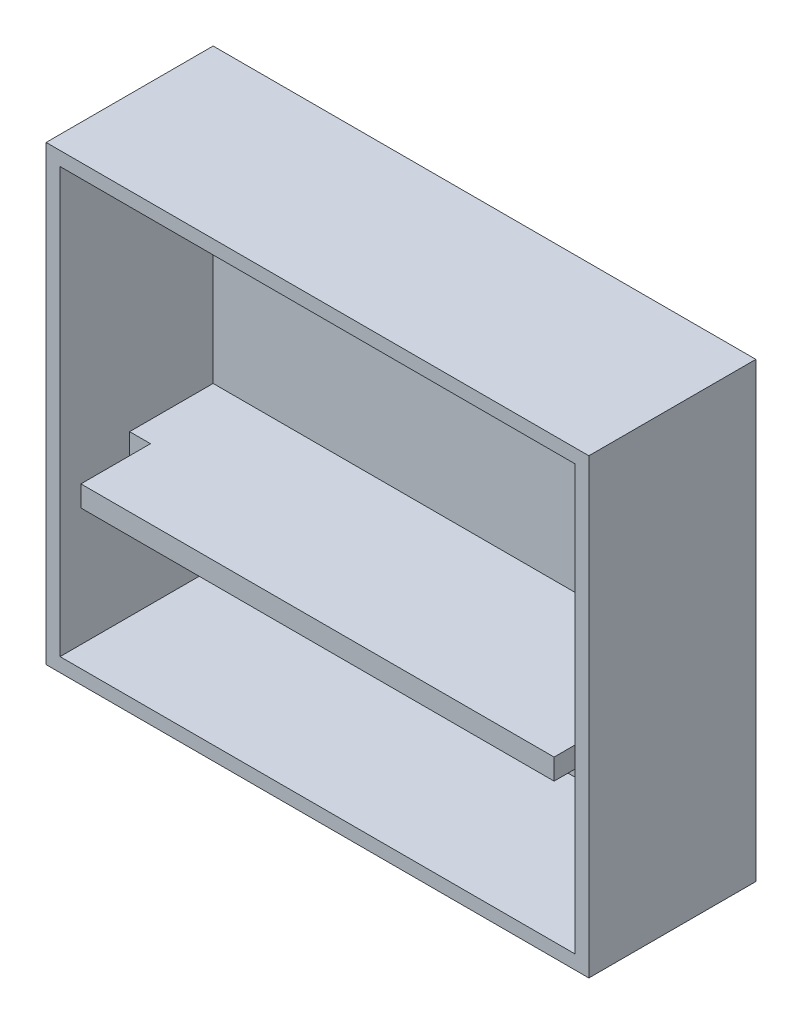
ISO-10303-21;
HEADER;
FILE_DESCRIPTION(('STEP AP214'),'2;1');
FILE_NAME('part.step','',(''),(''),'','','');
FILE_SCHEMA(('AUTOMOTIVE_DESIGN { 1 0 10303 214 1 1 1 1 }'));
ENDSEC;
DATA;
#1=APPLICATION_CONTEXT('core data for automotive mechanical design processes');
#2=APPLICATION_PROTOCOL_DEFINITION('international standard','automotive_design',2000,#1);
#3=PRODUCT_CONTEXT('',#1,'mechanical');
#4=PRODUCT('Part','Part','',(#3));
#5=PRODUCT_RELATED_PRODUCT_CATEGORY('part','',(#4));
#6=PRODUCT_DEFINITION_FORMATION('','',#4);
#7=PRODUCT_DEFINITION_CONTEXT('part definition',#1,'design');
#8=PRODUCT_DEFINITION('design','',#6,#7);
#9=PRODUCT_DEFINITION_SHAPE('','',#8);
#10=(LENGTH_UNIT() NAMED_UNIT(*) SI_UNIT(.MILLI.,.METRE.));
#11=(NAMED_UNIT(*) PLANE_ANGLE_UNIT() SI_UNIT($,.RADIAN.));
#12=(NAMED_UNIT(*) SI_UNIT($,.STERADIAN.) SOLID_ANGLE_UNIT());
#13=UNCERTAINTY_MEASURE_WITH_UNIT(LENGTH_MEASURE(1.E-05),#10,'distance_accuracy_value','');
#14=(GEOMETRIC_REPRESENTATION_CONTEXT(3) GLOBAL_UNCERTAINTY_ASSIGNED_CONTEXT((#13)) GLOBAL_UNIT_ASSIGNED_CONTEXT((#10,
#11,#12)) REPRESENTATION_CONTEXT('',''));
#15=CARTESIAN_POINT('',(0.,0.,0.));
#16=DIRECTION('',(0.,0.,1.));
#17=DIRECTION('',(1.,0.,0.));
#18=AXIS2_PLACEMENT_3D('',#15,#16,#17);
#19=CARTESIAN_POINT('',(0.,0.,24.));
#20=DIRECTION('',(0.,0.,-1.));
#21=DIRECTION('',(-1.,0.,0.));
#22=AXIS2_PLACEMENT_3D('',#19,#20,#21);
#23=PLANE('',#22);
#24=DIRECTION('',(0.,-1.,0.));
#25=VECTOR('',#24,1.);
#26=CARTESIAN_POINT('',(0.,0.,24.));
#27=LINE('',#26,#25);
#28=CARTESIAN_POINT('',(0.,65.,24.));
#29=VERTEX_POINT('',#28);
#30=CARTESIAN_POINT('',(0.,0.,24.));
#31=VERTEX_POINT('',#30);
#32=EDGE_CURVE('E211',#29,#31,#27,.T.);
#33=ORIENTED_EDGE('',*,*,#32,.T.);
#34=DIRECTION('',(1.,0.,0.));
#35=VECTOR('',#34,1.);
#36=CARTESIAN_POINT('',(0.,0.,24.));
#37=LINE('',#36,#35);
#38=CARTESIAN_POINT('',(78.,0.,24.));
#39=VERTEX_POINT('',#38);
#40=EDGE_CURVE('E214',#31,#39,#37,.T.);
#41=ORIENTED_EDGE('',*,*,#40,.T.);
#42=DIRECTION('',(0.,1.,0.));
#43=VECTOR('',#42,1.);
#44=CARTESIAN_POINT('',(78.,0.,24.));
#45=LINE('',#44,#43);
#46=CARTESIAN_POINT('',(78.,65.,24.));
#47=VERTEX_POINT('',#46);
#48=EDGE_CURVE('E217',#39,#47,#45,.T.);
#49=ORIENTED_EDGE('',*,*,#48,.T.);
#50=DIRECTION('',(-1.,0.,0.));
#51=VECTOR('',#50,1.);
#52=CARTESIAN_POINT('',(0.,65.,24.));
#53=LINE('',#52,#51);
#54=EDGE_CURVE('E219',#47,#29,#53,.T.);
#55=ORIENTED_EDGE('',*,*,#54,.T.);
#56=EDGE_LOOP('',(#33,#41,#49,#55));
#57=FACE_BOUND('',#56,.T.);
#58=DIRECTION('',(1.,0.,0.));
#59=VECTOR('',#58,1.);
#60=CARTESIAN_POINT('',(2.00000000000001,2.,24.));
#61=LINE('',#60,#59);
#62=CARTESIAN_POINT('',(2.00000000000001,2.,24.));
#63=VERTEX_POINT('',#62);
#64=CARTESIAN_POINT('',(76.,2.,24.));
#65=VERTEX_POINT('',#64);
#66=EDGE_CURVE('E174',#63,#65,#61,.T.);
#67=ORIENTED_EDGE('',*,*,#66,.F.);
#68=DIRECTION('',(0.,-1.,0.));
#69=VECTOR('',#68,1.);
#70=CARTESIAN_POINT('',(2.,63.,24.));
#71=LINE('',#70,#69);
#72=CARTESIAN_POINT('',(2.,63.,24.));
#73=VERTEX_POINT('',#72);
#74=EDGE_CURVE('E171',#73,#63,#71,.T.);
#75=ORIENTED_EDGE('',*,*,#74,.F.);
#76=DIRECTION('',(-1.,0.,0.));
#77=VECTOR('',#76,1.);
#78=CARTESIAN_POINT('',(2.,63.,24.));
#79=LINE('',#78,#77);
#80=CARTESIAN_POINT('',(76.,63.,24.));
#81=VERTEX_POINT('',#80);
#82=EDGE_CURVE('E198',#81,#73,#79,.T.);
#83=ORIENTED_EDGE('',*,*,#82,.F.);
#84=DIRECTION('',(0.,1.,0.));
#85=VECTOR('',#84,1.);
#86=CARTESIAN_POINT('',(76.,63.,24.));
#87=LINE('',#86,#85);
#88=EDGE_CURVE('E196',#65,#81,#87,.T.);
#89=ORIENTED_EDGE('',*,*,#88,.F.);
#90=EDGE_LOOP('',(#67,#75,#83,#89));
#91=FACE_BOUND('',#90,.T.);
#92=ADVANCED_FACE('F33',(#57,#91),#23,.F.);
#93=CARTESIAN_POINT('',(2.,63.,2.));
#94=DIRECTION('',(-1.,0.,0.));
#95=DIRECTION('',(0.,-1.,0.));
#96=AXIS2_PLACEMENT_3D('',#93,#94,#95);
#97=PLANE('',#96);
#98=ORIENTED_EDGE('',*,*,#74,.T.);
#99=DIRECTION('',(0.,0.,1.));
#100=VECTOR('',#99,1.);
#101=CARTESIAN_POINT('',(2.00000000000001,2.,2.));
#102=LINE('',#101,#100);
#103=CARTESIAN_POINT('',(2.00000000000001,2.,2.));
#104=VERTEX_POINT('',#103);
#105=EDGE_CURVE('E192',#104,#63,#102,.T.);
#106=ORIENTED_EDGE('',*,*,#105,.F.);
#107=DIRECTION('',(0.,-1.,0.));
#108=VECTOR('',#107,1.);
#109=CARTESIAN_POINT('',(2.,63.,2.));
#110=LINE('',#109,#108);
#111=CARTESIAN_POINT('',(2.,22.,2.));
#112=VERTEX_POINT('',#111);
#113=EDGE_CURVE('E170',#112,#104,#110,.T.);
#114=ORIENTED_EDGE('',*,*,#113,.F.);
#115=DIRECTION('',(0.,0.,-1.));
#116=VECTOR('',#115,1.);
#117=CARTESIAN_POINT('',(2.,22.,24.));
#118=LINE('',#117,#116);
#119=CARTESIAN_POINT('',(2.,22.,14.));
#120=VERTEX_POINT('',#119);
#121=EDGE_CURVE('E163',#120,#112,#118,.T.);
#122=ORIENTED_EDGE('',*,*,#121,.F.);
#123=DIRECTION('',(0.,-1.,0.));
#124=VECTOR('',#123,1.);
#125=CARTESIAN_POINT('',(2.,25.,14.));
#126=LINE('',#125,#124);
#127=CARTESIAN_POINT('',(2.,25.,14.));
#128=VERTEX_POINT('',#127);
#129=EDGE_CURVE('E147',#128,#120,#126,.T.);
#130=ORIENTED_EDGE('',*,*,#129,.F.);
#131=DIRECTION('',(0.,0.,-1.));
#132=VECTOR('',#131,1.);
#133=CARTESIAN_POINT('',(2.,25.,24.));
#134=LINE('',#133,#132);
#135=CARTESIAN_POINT('',(2.,25.,2.));
#136=VERTEX_POINT('',#135);
#137=EDGE_CURVE('E291',#128,#136,#134,.T.);
#138=ORIENTED_EDGE('',*,*,#137,.T.);
#139=CARTESIAN_POINT('',(2.,63.,2.));
#140=VERTEX_POINT('',#139);
#141=EDGE_CURVE('E180',#140,#136,#110,.T.);
#142=ORIENTED_EDGE('',*,*,#141,.F.);
#143=DIRECTION('',(0.,0.,1.));
#144=VECTOR('',#143,1.);
#145=CARTESIAN_POINT('',(2.,63.,2.));
#146=LINE('',#145,#144);
#147=EDGE_CURVE('E201',#140,#73,#146,.T.);
#148=ORIENTED_EDGE('',*,*,#147,.T.);
#149=EDGE_LOOP('',(#98,#106,#114,#122,#130,#138,#142,#148));
#150=FACE_BOUND('',#149,.T.);
#151=ADVANCED_FACE('F168',(#150),#97,.F.);
#152=CARTESIAN_POINT('',(76.,63.,2.));
#153=DIRECTION('',(1.,0.,0.));
#154=DIRECTION('',(0.,1.,0.));
#155=AXIS2_PLACEMENT_3D('',#152,#153,#154);
#156=PLANE('',#155);
#157=DIRECTION('',(0.,0.,-1.));
#158=VECTOR('',#157,1.);
#159=CARTESIAN_POINT('',(76.,25.,24.));
#160=LINE('',#159,#158);
#161=CARTESIAN_POINT('',(76.,25.,14.));
#162=VERTEX_POINT('',#161);
#163=CARTESIAN_POINT('',(76.,25.,2.));
#164=VERTEX_POINT('',#163);
#165=EDGE_CURVE('E176',#162,#164,#160,.T.);
#166=ORIENTED_EDGE('',*,*,#165,.F.);
#167=DIRECTION('',(0.,1.,0.));
#168=VECTOR('',#167,1.);
#169=CARTESIAN_POINT('',(76.,25.,14.));
#170=LINE('',#169,#168);
#171=CARTESIAN_POINT('',(76.,22.,14.));
#172=VERTEX_POINT('',#171);
#173=EDGE_CURVE('E58',#172,#162,#170,.T.);
#174=ORIENTED_EDGE('',*,*,#173,.F.);
#175=DIRECTION('',(0.,0.,-1.));
#176=VECTOR('',#175,1.);
#177=CARTESIAN_POINT('',(76.,22.,24.));
#178=LINE('',#177,#176);
#179=CARTESIAN_POINT('',(76.,22.,2.));
#180=VERTEX_POINT('',#179);
#181=EDGE_CURVE('E172',#172,#180,#178,.T.);
#182=ORIENTED_EDGE('',*,*,#181,.T.);
#183=DIRECTION('',(0.,1.,0.));
#184=VECTOR('',#183,1.);
#185=CARTESIAN_POINT('',(76.,63.,2.));
#186=LINE('',#185,#184);
#187=CARTESIAN_POINT('',(76.,2.,2.));
#188=VERTEX_POINT('',#187);
#189=EDGE_CURVE('E187',#188,#180,#186,.T.);
#190=ORIENTED_EDGE('',*,*,#189,.F.);
#191=DIRECTION('',(0.,0.,1.));
#192=VECTOR('',#191,1.);
#193=CARTESIAN_POINT('',(76.,2.,2.));
#194=LINE('',#193,#192);
#195=EDGE_CURVE('E207',#188,#65,#194,.T.);
#196=ORIENTED_EDGE('',*,*,#195,.T.);
#197=ORIENTED_EDGE('',*,*,#88,.T.);
#198=DIRECTION('',(0.,0.,1.));
#199=VECTOR('',#198,1.);
#200=CARTESIAN_POINT('',(76.,63.,2.));
#201=LINE('',#200,#199);
#202=CARTESIAN_POINT('',(76.,63.,2.));
#203=VERTEX_POINT('',#202);
#204=EDGE_CURVE('E204',#203,#81,#201,.T.);
#205=ORIENTED_EDGE('',*,*,#204,.F.);
#206=EDGE_CURVE('E186',#164,#203,#186,.T.);
#207=ORIENTED_EDGE('',*,*,#206,.F.);
#208=EDGE_LOOP('',(#166,#174,#182,#190,#196,#197,#205,#207));
#209=FACE_BOUND('',#208,.T.);
#210=ADVANCED_FACE('F306',(#209),#156,.F.);
#211=CARTESIAN_POINT('',(0.,0.,2.));
#212=DIRECTION('',(0.,0.,1.));
#213=DIRECTION('',(1.,0.,0.));
#214=AXIS2_PLACEMENT_3D('',#211,#212,#213);
#215=PLANE('',#214);
#216=ORIENTED_EDGE('',*,*,#189,.T.);
#217=DIRECTION('',(1.,0.,0.));
#218=VECTOR('',#217,1.);
#219=CARTESIAN_POINT('',(2.,22.,2.));
#220=LINE('',#219,#218);
#221=EDGE_CURVE('E269',#112,#180,#220,.T.);
#222=ORIENTED_EDGE('',*,*,#221,.F.);
#223=ORIENTED_EDGE('',*,*,#113,.T.);
#224=DIRECTION('',(1.,0.,0.));
#225=VECTOR('',#224,1.);
#226=CARTESIAN_POINT('',(2.00000000000001,2.,2.));
#227=LINE('',#226,#225);
#228=EDGE_CURVE('E183',#104,#188,#227,.T.);
#229=ORIENTED_EDGE('',*,*,#228,.T.);
#230=EDGE_LOOP('',(#216,#222,#223,#229));
#231=FACE_BOUND('',#230,.T.);
#232=ADVANCED_FACE('F372',(#231),#215,.T.);
#233=CARTESIAN_POINT('',(69.,56.,2.));
#234=DIRECTION('',(0.,0.,1.));
#235=DIRECTION('',(1.,0.,0.));
#236=AXIS2_PLACEMENT_3D('',#233,#234,#235);
#237=CIRCLE('',#236,2.5);
#238=CARTESIAN_POINT('',(71.5,56.,2.));
#239=VERTEX_POINT('',#238);
#240=EDGE_CURVE('E253',#239,#239,#237,.T.);
#241=ORIENTED_EDGE('',*,*,#240,.F.);
#242=EDGE_LOOP('',(#241));
#243=FACE_BOUND('',#242,.T.);
#244=CARTESIAN_POINT('',(20.5,56.,2.));
#245=DIRECTION('',(0.,0.,1.));
#246=DIRECTION('',(1.,0.,0.));
#247=AXIS2_PLACEMENT_3D('',#244,#245,#246);
#248=CIRCLE('',#247,2.5);
#249=CARTESIAN_POINT('',(23.,56.,2.));
#250=VERTEX_POINT('',#249);
#251=EDGE_CURVE('E252',#250,#250,#248,.T.);
#252=ORIENTED_EDGE('',*,*,#251,.F.);
#253=EDGE_LOOP('',(#252));
#254=FACE_BOUND('',#253,.T.);
#255=ORIENTED_EDGE('',*,*,#141,.T.);
#256=DIRECTION('',(-1.,0.,0.));
#257=VECTOR('',#256,1.);
#258=CARTESIAN_POINT('',(2.,25.,2.));
#259=LINE('',#258,#257);
#260=EDGE_CURVE('E288',#164,#136,#259,.T.);
#261=ORIENTED_EDGE('',*,*,#260,.F.);
#262=ORIENTED_EDGE('',*,*,#206,.T.);
#263=DIRECTION('',(-1.,0.,0.));
#264=VECTOR('',#263,1.);
#265=CARTESIAN_POINT('',(2.,63.,2.));
#266=LINE('',#265,#264);
#267=EDGE_CURVE('E190',#203,#140,#266,.T.);
#268=ORIENTED_EDGE('',*,*,#267,.T.);
#269=EDGE_LOOP('',(#255,#261,#262,#268));
#270=FACE_BOUND('',#269,.T.);
#271=ADVANCED_FACE('F303',(#243,#254,#270),#215,.T.);
#272=CARTESIAN_POINT('',(0.,0.,24.));
#273=DIRECTION('',(1.,0.,0.));
#274=DIRECTION('',(0.,0.,-1.));
#275=AXIS2_PLACEMENT_3D('',#272,#273,#274);
#276=PLANE('',#275);
#277=DIRECTION('',(0.,-1.,0.));
#278=VECTOR('',#277,1.);
#279=CARTESIAN_POINT('',(0.,0.,0.));
#280=LINE('',#279,#278);
#281=CARTESIAN_POINT('',(0.,65.,0.));
#282=VERTEX_POINT('',#281);
#283=CARTESIAN_POINT('',(0.,0.,0.));
#284=VERTEX_POINT('',#283);
#285=EDGE_CURVE('E203',#282,#284,#280,.T.);
#286=ORIENTED_EDGE('',*,*,#285,.T.);
#287=DIRECTION('',(0.,0.,-1.));
#288=VECTOR('',#287,1.);
#289=CARTESIAN_POINT('',(0.,0.,24.));
#290=LINE('',#289,#288);
#291=EDGE_CURVE('E37',#31,#284,#290,.T.);
#292=ORIENTED_EDGE('',*,*,#291,.F.);
#293=ORIENTED_EDGE('',*,*,#32,.F.);
#294=DIRECTION('',(0.,0.,-1.));
#295=VECTOR('',#294,1.);
#296=CARTESIAN_POINT('',(0.,65.,24.));
#297=LINE('',#296,#295);
#298=EDGE_CURVE('E221',#29,#282,#297,.T.);
#299=ORIENTED_EDGE('',*,*,#298,.T.);
#300=EDGE_LOOP('',(#286,#292,#293,#299));
#301=FACE_BOUND('',#300,.T.);
#302=ADVANCED_FACE('F35',(#301),#276,.F.);
#303=CARTESIAN_POINT('',(0.,0.,24.));
#304=DIRECTION('',(0.,1.,0.));
#305=DIRECTION('',(0.,0.,1.));
#306=AXIS2_PLACEMENT_3D('',#303,#304,#305);
#307=PLANE('',#306);
#308=DIRECTION('',(1.,0.,0.));
#309=VECTOR('',#308,1.);
#310=CARTESIAN_POINT('',(0.,0.,0.));
#311=LINE('',#310,#309);
#312=CARTESIAN_POINT('',(78.,0.,0.));
#313=VERTEX_POINT('',#312);
#314=EDGE_CURVE('E224',#284,#313,#311,.T.);
#315=ORIENTED_EDGE('',*,*,#314,.T.);
#316=DIRECTION('',(0.,0.,-1.));
#317=VECTOR('',#316,1.);
#318=CARTESIAN_POINT('',(78.,0.,24.));
#319=LINE('',#318,#317);
#320=EDGE_CURVE('E233',#39,#313,#319,.T.);
#321=ORIENTED_EDGE('',*,*,#320,.F.);
#322=ORIENTED_EDGE('',*,*,#40,.F.);
#323=ORIENTED_EDGE('',*,*,#291,.T.);
#324=EDGE_LOOP('',(#315,#321,#322,#323));
#325=FACE_BOUND('',#324,.T.);
#326=ADVANCED_FACE('F356',(#325),#307,.F.);
#327=CARTESIAN_POINT('',(78.,0.,24.));
#328=DIRECTION('',(-1.,0.,0.));
#329=DIRECTION('',(0.,0.,1.));
#330=AXIS2_PLACEMENT_3D('',#327,#328,#329);
#331=PLANE('',#330);
#332=DIRECTION('',(0.,1.,0.));
#333=VECTOR('',#332,1.);
#334=CARTESIAN_POINT('',(78.,0.,0.));
#335=LINE('',#334,#333);
#336=CARTESIAN_POINT('',(78.,65.,0.));
#337=VERTEX_POINT('',#336);
#338=EDGE_CURVE('E226',#313,#337,#335,.T.);
#339=ORIENTED_EDGE('',*,*,#338,.T.);
#340=DIRECTION('',(0.,0.,-1.));
#341=VECTOR('',#340,1.);
#342=CARTESIAN_POINT('',(78.,65.,24.));
#343=LINE('',#342,#341);
#344=EDGE_CURVE('E231',#47,#337,#343,.T.);
#345=ORIENTED_EDGE('',*,*,#344,.F.);
#346=ORIENTED_EDGE('',*,*,#48,.F.);
#347=ORIENTED_EDGE('',*,*,#320,.T.);
#348=EDGE_LOOP('',(#339,#345,#346,#347));
#349=FACE_BOUND('',#348,.T.);
#350=ADVANCED_FACE('F350',(#349),#331,.F.);
#351=CARTESIAN_POINT('',(0.,65.,24.));
#352=DIRECTION('',(0.,-1.,0.));
#353=DIRECTION('',(0.,0.,-1.));
#354=AXIS2_PLACEMENT_3D('',#351,#352,#353);
#355=PLANE('',#354);
#356=DIRECTION('',(-1.,0.,0.));
#357=VECTOR('',#356,1.);
#358=CARTESIAN_POINT('',(0.,65.,0.));
#359=LINE('',#358,#357);
#360=EDGE_CURVE('E215',#337,#282,#359,.T.);
#361=ORIENTED_EDGE('',*,*,#360,.T.);
#362=ORIENTED_EDGE('',*,*,#298,.F.);
#363=ORIENTED_EDGE('',*,*,#54,.F.);
#364=ORIENTED_EDGE('',*,*,#344,.T.);
#365=EDGE_LOOP('',(#361,#362,#363,#364));
#366=FACE_BOUND('',#365,.T.);
#367=ADVANCED_FACE('F344',(#366),#355,.F.);
#368=DIRECTION('',(-1.,0.,0.));
#369=VECTOR('',#368,1.);
#370=CARTESIAN_POINT('',(2.,25.,24.));
#371=LINE('',#370,#369);
#372=CARTESIAN_POINT('',(73.,25.,24.));
#373=VERTEX_POINT('',#372);
#374=CARTESIAN_POINT('',(5.,25.,24.));
#375=VERTEX_POINT('',#374);
#376=EDGE_CURVE('E287',#373,#375,#371,.T.);
#377=ORIENTED_EDGE('',*,*,#376,.T.);
#378=DIRECTION('',(0.,1.,0.));
#379=VECTOR('',#378,1.);
#380=CARTESIAN_POINT('',(5.,25.,24.));
#381=LINE('',#380,#379);
#382=CARTESIAN_POINT('',(5.,22.,24.));
#383=VERTEX_POINT('',#382);
#384=EDGE_CURVE('E157',#383,#375,#381,.T.);
#385=ORIENTED_EDGE('',*,*,#384,.F.);
#386=DIRECTION('',(1.,0.,0.));
#387=VECTOR('',#386,1.);
#388=CARTESIAN_POINT('',(2.,22.,24.));
#389=LINE('',#388,#387);
#390=CARTESIAN_POINT('',(73.,22.,24.));
#391=VERTEX_POINT('',#390);
#392=EDGE_CURVE('E284',#383,#391,#389,.T.);
#393=ORIENTED_EDGE('',*,*,#392,.T.);
#394=DIRECTION('',(0.,-1.,0.));
#395=VECTOR('',#394,1.);
#396=CARTESIAN_POINT('',(73.,25.,24.));
#397=LINE('',#396,#395);
#398=EDGE_CURVE('E259',#373,#391,#397,.T.);
#399=ORIENTED_EDGE('',*,*,#398,.F.);
#400=EDGE_LOOP('',(#377,#385,#393,#399));
#401=FACE_BOUND('',#400,.T.);
#402=ADVANCED_FACE('F318',(#401),#23,.F.);
#403=CARTESIAN_POINT('',(0.,0.,0.));
#404=DIRECTION('',(0.,0.,-1.));
#405=DIRECTION('',(-1.,0.,0.));
#406=AXIS2_PLACEMENT_3D('',#403,#404,#405);
#407=PLANE('',#406);
#408=ORIENTED_EDGE('',*,*,#285,.F.);
#409=ORIENTED_EDGE('',*,*,#360,.F.);
#410=ORIENTED_EDGE('',*,*,#338,.F.);
#411=ORIENTED_EDGE('',*,*,#314,.F.);
#412=EDGE_LOOP('',(#408,#409,#410,#411));
#413=FACE_BOUND('',#412,.T.);
#414=ADVANCED_FACE('F343',(#413),#407,.T.);
#415=CARTESIAN_POINT('',(2.,63.,2.));
#416=DIRECTION('',(0.,1.,0.));
#417=DIRECTION('',(0.,0.,1.));
#418=AXIS2_PLACEMENT_3D('',#415,#416,#417);
#419=PLANE('',#418);
#420=ORIENTED_EDGE('',*,*,#82,.T.);
#421=ORIENTED_EDGE('',*,*,#147,.F.);
#422=ORIENTED_EDGE('',*,*,#267,.F.);
#423=ORIENTED_EDGE('',*,*,#204,.T.);
#424=EDGE_LOOP('',(#420,#421,#422,#423));
#425=FACE_BOUND('',#424,.T.);
#426=ADVANCED_FACE('F311',(#425),#419,.F.);
#427=CARTESIAN_POINT('',(2.00000000000001,2.,2.));
#428=DIRECTION('',(0.,-1.,0.));
#429=DIRECTION('',(0.,0.,-1.));
#430=AXIS2_PLACEMENT_3D('',#427,#428,#429);
#431=PLANE('',#430);
#432=ORIENTED_EDGE('',*,*,#66,.T.);
#433=ORIENTED_EDGE('',*,*,#195,.F.);
#434=ORIENTED_EDGE('',*,*,#228,.F.);
#435=ORIENTED_EDGE('',*,*,#105,.T.);
#436=EDGE_LOOP('',(#432,#433,#434,#435));
#437=FACE_BOUND('',#436,.T.);
#438=ADVANCED_FACE('F386',(#437),#431,.F.);
#439=CARTESIAN_POINT('',(2.,22.,24.));
#440=DIRECTION('',(0.,1.,0.));
#441=DIRECTION('',(0.,0.,1.));
#442=AXIS2_PLACEMENT_3D('',#439,#440,#441);
#443=PLANE('',#442);
#444=ORIENTED_EDGE('',*,*,#392,.F.);
#445=DIRECTION('',(0.,0.,1.));
#446=VECTOR('',#445,1.);
#447=CARTESIAN_POINT('',(5.,22.,14.));
#448=LINE('',#447,#446);
#449=CARTESIAN_POINT('',(5.,22.,14.));
#450=VERTEX_POINT('',#449);
#451=EDGE_CURVE('E165',#450,#383,#448,.T.);
#452=ORIENTED_EDGE('',*,*,#451,.F.);
#453=DIRECTION('',(1.,0.,0.));
#454=VECTOR('',#453,1.);
#455=CARTESIAN_POINT('',(2.,22.,14.));
#456=LINE('',#455,#454);
#457=EDGE_CURVE('E150',#120,#450,#456,.T.);
#458=ORIENTED_EDGE('',*,*,#457,.F.);
#459=ORIENTED_EDGE('',*,*,#121,.T.);
#460=ORIENTED_EDGE('',*,*,#221,.T.);
#461=ORIENTED_EDGE('',*,*,#181,.F.);
#462=DIRECTION('',(1.,0.,0.));
#463=VECTOR('',#462,1.);
#464=CARTESIAN_POINT('',(76.,22.,14.));
#465=LINE('',#464,#463);
#466=CARTESIAN_POINT('',(73.,22.,14.));
#467=VERTEX_POINT('',#466);
#468=EDGE_CURVE('E277',#467,#172,#465,.T.);
#469=ORIENTED_EDGE('',*,*,#468,.F.);
#470=DIRECTION('',(0.,0.,1.));
#471=VECTOR('',#470,1.);
#472=CARTESIAN_POINT('',(73.,22.,14.));
#473=LINE('',#472,#471);
#474=EDGE_CURVE('E265',#467,#391,#473,.T.);
#475=ORIENTED_EDGE('',*,*,#474,.T.);
#476=EDGE_LOOP('',(#444,#452,#458,#459,#460,#461,#469,#475));
#477=FACE_BOUND('',#476,.T.);
#478=ADVANCED_FACE('F161',(#477),#443,.F.);
#479=CARTESIAN_POINT('',(2.,25.,24.));
#480=DIRECTION('',(0.,-1.,0.));
#481=DIRECTION('',(0.,0.,-1.));
#482=AXIS2_PLACEMENT_3D('',#479,#480,#481);
#483=PLANE('',#482);
#484=DIRECTION('',(-1.,0.,0.));
#485=VECTOR('',#484,1.);
#486=CARTESIAN_POINT('',(2.,25.,14.));
#487=LINE('',#486,#485);
#488=CARTESIAN_POINT('',(5.,25.,14.));
#489=VERTEX_POINT('',#488);
#490=EDGE_CURVE('E153',#489,#128,#487,.T.);
#491=ORIENTED_EDGE('',*,*,#490,.F.);
#492=DIRECTION('',(0.,0.,1.));
#493=VECTOR('',#492,1.);
#494=CARTESIAN_POINT('',(5.,25.,14.));
#495=LINE('',#494,#493);
#496=EDGE_CURVE('E266',#489,#375,#495,.T.);
#497=ORIENTED_EDGE('',*,*,#496,.T.);
#498=ORIENTED_EDGE('',*,*,#376,.F.);
#499=DIRECTION('',(0.,0.,1.));
#500=VECTOR('',#499,1.);
#501=CARTESIAN_POINT('',(73.,25.,14.));
#502=LINE('',#501,#500);
#503=CARTESIAN_POINT('',(73.,25.,14.));
#504=VERTEX_POINT('',#503);
#505=EDGE_CURVE('E279',#504,#373,#502,.T.);
#506=ORIENTED_EDGE('',*,*,#505,.F.);
#507=DIRECTION('',(-1.,0.,0.));
#508=VECTOR('',#507,1.);
#509=CARTESIAN_POINT('',(76.,25.,14.));
#510=LINE('',#509,#508);
#511=EDGE_CURVE('E272',#162,#504,#510,.T.);
#512=ORIENTED_EDGE('',*,*,#511,.F.);
#513=ORIENTED_EDGE('',*,*,#165,.T.);
#514=ORIENTED_EDGE('',*,*,#260,.T.);
#515=ORIENTED_EDGE('',*,*,#137,.F.);
#516=EDGE_LOOP('',(#491,#497,#498,#506,#512,#513,#514,#515));
#517=FACE_BOUND('',#516,.T.);
#518=ADVANCED_FACE('F298',(#517),#483,.F.);
#519=CARTESIAN_POINT('',(73.,25.,14.));
#520=DIRECTION('',(-1.,0.,0.));
#521=DIRECTION('',(0.,0.,1.));
#522=AXIS2_PLACEMENT_3D('',#519,#520,#521);
#523=PLANE('',#522);
#524=ORIENTED_EDGE('',*,*,#398,.T.);
#525=ORIENTED_EDGE('',*,*,#474,.F.);
#526=DIRECTION('',(0.,-1.,0.));
#527=VECTOR('',#526,1.);
#528=CARTESIAN_POINT('',(73.,25.,14.));
#529=LINE('',#528,#527);
#530=EDGE_CURVE('E274',#504,#467,#529,.T.);
#531=ORIENTED_EDGE('',*,*,#530,.F.);
#532=ORIENTED_EDGE('',*,*,#505,.T.);
#533=EDGE_LOOP('',(#524,#525,#531,#532));
#534=FACE_BOUND('',#533,.T.);
#535=ADVANCED_FACE('F320',(#534),#523,.F.);
#536=CARTESIAN_POINT('',(0.,0.,14.));
#537=DIRECTION('',(0.,0.,-1.));
#538=DIRECTION('',(-1.,0.,0.));
#539=AXIS2_PLACEMENT_3D('',#536,#537,#538);
#540=PLANE('',#539);
#541=ORIENTED_EDGE('',*,*,#173,.T.);
#542=ORIENTED_EDGE('',*,*,#511,.T.);
#543=ORIENTED_EDGE('',*,*,#530,.T.);
#544=ORIENTED_EDGE('',*,*,#468,.T.);
#545=EDGE_LOOP('',(#541,#542,#543,#544));
#546=FACE_BOUND('',#545,.T.);
#547=ADVANCED_FACE('F323',(#546),#540,.F.);
#548=CARTESIAN_POINT('',(5.,25.,14.));
#549=DIRECTION('',(1.,0.,0.));
#550=DIRECTION('',(0.,0.,-1.));
#551=AXIS2_PLACEMENT_3D('',#548,#549,#550);
#552=PLANE('',#551);
#553=ORIENTED_EDGE('',*,*,#384,.T.);
#554=ORIENTED_EDGE('',*,*,#496,.F.);
#555=DIRECTION('',(0.,1.,0.));
#556=VECTOR('',#555,1.);
#557=CARTESIAN_POINT('',(5.,25.,14.));
#558=LINE('',#557,#556);
#559=EDGE_CURVE('E50',#450,#489,#558,.T.);
#560=ORIENTED_EDGE('',*,*,#559,.F.);
#561=ORIENTED_EDGE('',*,*,#451,.T.);
#562=EDGE_LOOP('',(#553,#554,#560,#561));
#563=FACE_BOUND('',#562,.T.);
#564=ADVANCED_FACE('F325',(#563),#552,.F.);
#565=CARTESIAN_POINT('',(0.,0.,14.));
#566=DIRECTION('',(0.,0.,1.));
#567=DIRECTION('',(1.,0.,0.));
#568=AXIS2_PLACEMENT_3D('',#565,#566,#567);
#569=PLANE('',#568);
#570=ORIENTED_EDGE('',*,*,#129,.T.);
#571=ORIENTED_EDGE('',*,*,#457,.T.);
#572=ORIENTED_EDGE('',*,*,#559,.T.);
#573=ORIENTED_EDGE('',*,*,#490,.T.);
#574=EDGE_LOOP('',(#570,#571,#572,#573));
#575=FACE_BOUND('',#574,.T.);
#576=ADVANCED_FACE('F149',(#575),#569,.T.);
#577=CARTESIAN_POINT('',(20.5,56.,5.));
#578=DIRECTION('',(0.,0.,-1.));
#579=DIRECTION('',(-1.,0.,0.));
#580=AXIS2_PLACEMENT_3D('',#577,#578,#579);
#581=CYLINDRICAL_SURFACE('',#580,2.5);
#582=CARTESIAN_POINT('',(20.5,56.,5.));
#583=DIRECTION('',(0.,0.,1.));
#584=DIRECTION('',(1.,0.,0.));
#585=AXIS2_PLACEMENT_3D('',#582,#583,#584);
#586=CIRCLE('',#585,2.5);
#587=CARTESIAN_POINT('',(23.,56.,5.));
#588=VERTEX_POINT('',#587);
#589=EDGE_CURVE('E256',#588,#588,#586,.T.);
#590=ORIENTED_EDGE('',*,*,#589,.F.);
#591=EDGE_LOOP('',(#590));
#592=FACE_BOUND('',#591,.T.);
#593=ORIENTED_EDGE('',*,*,#251,.T.);
#594=EDGE_LOOP('',(#593));
#595=FACE_BOUND('',#594,.T.);
#596=ADVANCED_FACE('F425',(#592,#595),#581,.T.);
#597=CARTESIAN_POINT('',(20.5,56.,5.));
#598=DIRECTION('',(0.,0.,1.));
#599=DIRECTION('',(1.,0.,0.));
#600=AXIS2_PLACEMENT_3D('',#597,#598,#599);
#601=PLANE('',#600);
#602=CARTESIAN_POINT('',(20.5,56.,5.));
#603=DIRECTION('',(0.,0.,1.));
#604=DIRECTION('',(1.,0.,0.));
#605=AXIS2_PLACEMENT_3D('',#602,#603,#604);
#606=CIRCLE('',#605,1.);
#607=CARTESIAN_POINT('',(21.5,56.,5.));
#608=VERTEX_POINT('',#607);
#609=EDGE_CURVE('E42',#608,#608,#606,.T.);
#610=ORIENTED_EDGE('',*,*,#609,.F.);
#611=EDGE_LOOP('',(#610));
#612=FACE_BOUND('',#611,.T.);
#613=ORIENTED_EDGE('',*,*,#589,.T.);
#614=EDGE_LOOP('',(#613));
#615=FACE_BOUND('',#614,.T.);
#616=ADVANCED_FACE('F441',(#612,#615),#601,.T.);
#617=CARTESIAN_POINT('',(69.,56.,5.));
#618=DIRECTION('',(0.,0.,-1.));
#619=DIRECTION('',(-1.,0.,0.));
#620=AXIS2_PLACEMENT_3D('',#617,#618,#619);
#621=CYLINDRICAL_SURFACE('',#620,2.5);
#622=CARTESIAN_POINT('',(69.,56.,5.));
#623=DIRECTION('',(0.,0.,1.));
#624=DIRECTION('',(1.,0.,0.));
#625=AXIS2_PLACEMENT_3D('',#622,#623,#624);
#626=CIRCLE('',#625,2.5);
#627=CARTESIAN_POINT('',(71.5,56.,5.));
#628=VERTEX_POINT('',#627);
#629=EDGE_CURVE('E249',#628,#628,#626,.T.);
#630=ORIENTED_EDGE('',*,*,#629,.F.);
#631=EDGE_LOOP('',(#630));
#632=FACE_BOUND('',#631,.T.);
#633=ORIENTED_EDGE('',*,*,#240,.T.);
#634=EDGE_LOOP('',(#633));
#635=FACE_BOUND('',#634,.T.);
#636=ADVANCED_FACE('F449',(#632,#635),#621,.T.);
#637=CARTESIAN_POINT('',(69.,56.,5.));
#638=DIRECTION('',(0.,0.,1.));
#639=DIRECTION('',(1.,0.,0.));
#640=AXIS2_PLACEMENT_3D('',#637,#638,#639);
#641=PLANE('',#640);
#642=CARTESIAN_POINT('',(69.,56.,5.));
#643=DIRECTION('',(0.,0.,1.));
#644=DIRECTION('',(1.,0.,0.));
#645=AXIS2_PLACEMENT_3D('',#642,#643,#644);
#646=CIRCLE('',#645,0.999999999999998);
#647=CARTESIAN_POINT('',(70.,56.,5.));
#648=VERTEX_POINT('',#647);
#649=EDGE_CURVE('E11',#648,#648,#646,.T.);
#650=ORIENTED_EDGE('',*,*,#649,.F.);
#651=EDGE_LOOP('',(#650));
#652=FACE_BOUND('',#651,.T.);
#653=ORIENTED_EDGE('',*,*,#629,.T.);
#654=EDGE_LOOP('',(#653));
#655=FACE_BOUND('',#654,.T.);
#656=ADVANCED_FACE('F454',(#652,#655),#641,.T.);
#657=CARTESIAN_POINT('',(20.5,56.,10.));
#658=DIRECTION('',(0.,0.,-1.));
#659=DIRECTION('',(-1.,0.,0.));
#660=AXIS2_PLACEMENT_3D('',#657,#658,#659);
#661=CYLINDRICAL_SURFACE('',#660,1.);
#662=CARTESIAN_POINT('',(20.5,56.,10.));
#663=DIRECTION('',(0.,0.,1.));
#664=DIRECTION('',(1.,0.,0.));
#665=AXIS2_PLACEMENT_3D('',#662,#663,#664);
#666=CIRCLE('',#665,1.);
#667=CARTESIAN_POINT('',(21.5,56.,10.));
#668=VERTEX_POINT('',#667);
#669=EDGE_CURVE('E248',#668,#668,#666,.T.);
#670=ORIENTED_EDGE('',*,*,#669,.F.);
#671=EDGE_LOOP('',(#670));
#672=FACE_BOUND('',#671,.T.);
#673=ORIENTED_EDGE('',*,*,#609,.T.);
#674=EDGE_LOOP('',(#673));
#675=FACE_BOUND('',#674,.T.);
#676=ADVANCED_FACE('F471',(#672,#675),#661,.T.);
#677=CARTESIAN_POINT('',(20.5,56.,10.));
#678=DIRECTION('',(0.,0.,1.));
#679=DIRECTION('',(1.,0.,0.));
#680=AXIS2_PLACEMENT_3D('',#677,#678,#679);
#681=PLANE('',#680);
#682=ORIENTED_EDGE('',*,*,#669,.T.);
#683=EDGE_LOOP('',(#682));
#684=FACE_BOUND('',#683,.T.);
#685=ADVANCED_FACE('F481',(#684),#681,.T.);
#686=CARTESIAN_POINT('',(69.,56.,10.));
#687=DIRECTION('',(0.,0.,-1.));
#688=DIRECTION('',(-1.,0.,0.));
#689=AXIS2_PLACEMENT_3D('',#686,#687,#688);
#690=CYLINDRICAL_SURFACE('',#689,0.999999999999998);
#691=CARTESIAN_POINT('',(69.,56.,10.));
#692=DIRECTION('',(0.,0.,1.));
#693=DIRECTION('',(1.,0.,0.));
#694=AXIS2_PLACEMENT_3D('',#691,#692,#693);
#695=CIRCLE('',#694,0.999999999999998);
#696=CARTESIAN_POINT('',(70.,56.,10.));
#697=VERTEX_POINT('',#696);
#698=EDGE_CURVE('E517',#697,#697,#695,.T.);
#699=ORIENTED_EDGE('',*,*,#698,.F.);
#700=EDGE_LOOP('',(#699));
#701=FACE_BOUND('',#700,.T.);
#702=ORIENTED_EDGE('',*,*,#649,.T.);
#703=EDGE_LOOP('',(#702));
#704=FACE_BOUND('',#703,.T.);
#705=ADVANCED_FACE('F491',(#701,#704),#690,.T.);
#706=CARTESIAN_POINT('',(69.,56.,10.));
#707=DIRECTION('',(0.,0.,1.));
#708=DIRECTION('',(1.,0.,0.));
#709=AXIS2_PLACEMENT_3D('',#706,#707,#708);
#710=PLANE('',#709);
#711=ORIENTED_EDGE('',*,*,#698,.T.);
#712=EDGE_LOOP('',(#711));
#713=FACE_BOUND('',#712,.T.);
#714=ADVANCED_FACE('F501',(#713),#710,.T.);
#715=CLOSED_SHELL('',(#92,#151,#210,#232,#271,#302,#326,#350,#367,#402,#414,#426,#438,#478,#518,
#535,#547,#564,#576,#596,#616,#636,#656,#676,#685,#705,#714));
#716=MANIFOLD_SOLID_BREP('B2',#715);
#717=ADVANCED_BREP_SHAPE_REPRESENTATION('',(#18,#716),#14);
#718=SHAPE_DEFINITION_REPRESENTATION(#9,#717);
ENDSEC;
END-ISO-10303-21;
